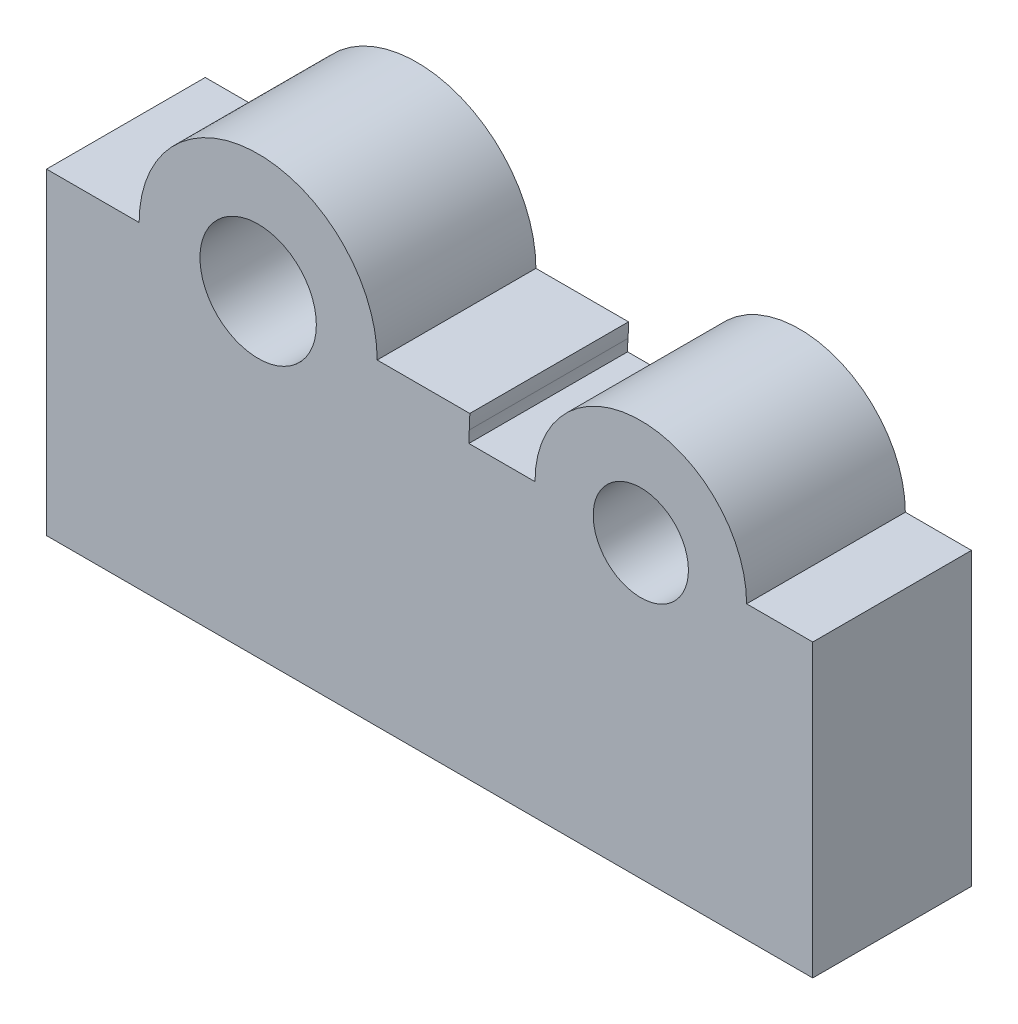
ISO-10303-21;
HEADER;
FILE_DESCRIPTION(('STEP AP214'),'2;1');
FILE_NAME('part.step','',(''),(''),'','','');
FILE_SCHEMA(('AUTOMOTIVE_DESIGN { 1 0 10303 214 1 1 1 1 }'));
ENDSEC;
DATA;
#1=APPLICATION_CONTEXT('core data for automotive mechanical design processes');
#2=APPLICATION_PROTOCOL_DEFINITION('international standard','automotive_design',2000,#1);
#3=PRODUCT_CONTEXT('',#1,'mechanical');
#4=PRODUCT('Part','Part','',(#3));
#5=PRODUCT_RELATED_PRODUCT_CATEGORY('part','',(#4));
#6=PRODUCT_DEFINITION_FORMATION('','',#4);
#7=PRODUCT_DEFINITION_CONTEXT('part definition',#1,'design');
#8=PRODUCT_DEFINITION('design','',#6,#7);
#9=PRODUCT_DEFINITION_SHAPE('','',#8);
#10=(LENGTH_UNIT() NAMED_UNIT(*) SI_UNIT(.MILLI.,.METRE.));
#11=(NAMED_UNIT(*) PLANE_ANGLE_UNIT() SI_UNIT($,.RADIAN.));
#12=(NAMED_UNIT(*) SI_UNIT($,.STERADIAN.) SOLID_ANGLE_UNIT());
#13=UNCERTAINTY_MEASURE_WITH_UNIT(LENGTH_MEASURE(1.E-05),#10,'distance_accuracy_value','');
#14=(GEOMETRIC_REPRESENTATION_CONTEXT(3) GLOBAL_UNCERTAINTY_ASSIGNED_CONTEXT((#13)) GLOBAL_UNIT_ASSIGNED_CONTEXT((#10,
#11,#12)) REPRESENTATION_CONTEXT('',''));
#15=CARTESIAN_POINT('',(0.,0.,0.));
#16=DIRECTION('',(0.,0.,1.));
#17=DIRECTION('',(1.,0.,0.));
#18=AXIS2_PLACEMENT_3D('',#15,#16,#17);
#19=CARTESIAN_POINT('',(0.,0.,30.));
#20=DIRECTION('',(0.,0.,-1.));
#21=DIRECTION('',(-1.,0.,0.));
#22=AXIS2_PLACEMENT_3D('',#19,#20,#21);
#23=CYLINDRICAL_SURFACE('',#22,11.2);
#24=CARTESIAN_POINT('',(0.,0.,0.));
#25=DIRECTION('',(0.,0.,1.));
#26=DIRECTION('',(1.,0.,0.));
#27=AXIS2_PLACEMENT_3D('',#24,#25,#26);
#28=CIRCLE('',#27,11.2);
#29=CARTESIAN_POINT('',(11.2,0.,0.));
#30=VERTEX_POINT('',#29);
#31=EDGE_CURVE('E178',#30,#30,#28,.T.);
#32=ORIENTED_EDGE('',*,*,#31,.F.);
#33=EDGE_LOOP('',(#32));
#34=FACE_BOUND('',#33,.T.);
#35=CARTESIAN_POINT('',(0.,0.,7.));
#36=DIRECTION('',(0.,0.,1.));
#37=DIRECTION('',(1.,0.,0.));
#38=AXIS2_PLACEMENT_3D('',#35,#36,#37);
#39=CIRCLE('',#38,11.2);
#40=CARTESIAN_POINT('',(11.2,0.,7.));
#41=VERTEX_POINT('',#40);
#42=EDGE_CURVE('E211',#41,#41,#39,.T.);
#43=ORIENTED_EDGE('',*,*,#42,.T.);
#44=EDGE_LOOP('',(#43));
#45=FACE_BOUND('',#44,.T.);
#46=ADVANCED_FACE('F51',(#34,#45),#23,.F.);
#47=CARTESIAN_POINT('',(0.,0.,30.));
#48=DIRECTION('',(0.,0.,-1.));
#49=DIRECTION('',(-1.,0.,0.));
#50=AXIS2_PLACEMENT_3D('',#47,#48,#49);
#51=CYLINDRICAL_SURFACE('',#50,32.5);
#52=CARTESIAN_POINT('',(0.,0.,0.));
#53=DIRECTION('',(0.,0.,1.));
#54=DIRECTION('',(1.,0.,0.));
#55=AXIS2_PLACEMENT_3D('',#52,#53,#54);
#56=CIRCLE('',#55,32.5);
#57=CARTESIAN_POINT('',(-32.4226189378211,2.24137931034483,0.));
#58=VERTEX_POINT('',#57);
#59=CARTESIAN_POINT('',(-32.5,0.,0.));
#60=VERTEX_POINT('',#59);
#61=EDGE_CURVE('E165',#58,#60,#56,.T.);
#62=ORIENTED_EDGE('',*,*,#61,.F.);
#63=DIRECTION('',(0.,0.,-1.));
#64=VECTOR('',#63,1.);
#65=CARTESIAN_POINT('',(-32.4226189378211,2.24137931034483,30.));
#66=LINE('',#65,#64);
#67=CARTESIAN_POINT('',(-32.4226189378211,2.24137931034483,30.));
#68=VERTEX_POINT('',#67);
#69=EDGE_CURVE('E12',#68,#58,#66,.T.);
#70=ORIENTED_EDGE('',*,*,#69,.F.);
#71=CARTESIAN_POINT('',(0.,0.,30.));
#72=DIRECTION('',(0.,0.,1.));
#73=DIRECTION('',(1.,0.,0.));
#74=AXIS2_PLACEMENT_3D('',#71,#72,#73);
#75=CIRCLE('',#74,32.5);
#76=CARTESIAN_POINT('',(-32.5,0.,30.));
#77=VERTEX_POINT('',#76);
#78=EDGE_CURVE('E225',#68,#77,#75,.T.);
#79=ORIENTED_EDGE('',*,*,#78,.T.);
#80=DIRECTION('',(0.,0.,-1.));
#81=VECTOR('',#80,1.);
#82=CARTESIAN_POINT('',(-32.5,0.,30.));
#83=LINE('',#82,#81);
#84=EDGE_CURVE('E182',#77,#60,#83,.T.);
#85=ORIENTED_EDGE('',*,*,#84,.T.);
#86=EDGE_LOOP('',(#62,#70,#79,#85));
#87=FACE_BOUND('',#86,.T.);
#88=ADVANCED_FACE('F53',(#87),#51,.F.);
#89=CARTESIAN_POINT('',(-72.3273807074472,5.,30.));
#90=DIRECTION('',(0.,0.,-1.));
#91=DIRECTION('',(-1.,0.,0.));
#92=AXIS2_PLACEMENT_3D('',#89,#90,#91);
#93=CYLINDRICAL_SURFACE('',#92,40.);
#94=CARTESIAN_POINT('',(-72.3273807074472,5.,0.));
#95=DIRECTION('',(0.,0.,1.));
#96=DIRECTION('',(1.,0.,0.));
#97=AXIS2_PLACEMENT_3D('',#94,#95,#96);
#98=CIRCLE('',#97,40.);
#99=CARTESIAN_POINT('',(-32.3273807074472,5.00000000000001,0.));
#100=VERTEX_POINT('',#99);
#101=EDGE_CURVE('E162',#58,#100,#98,.T.);
#102=ORIENTED_EDGE('',*,*,#101,.T.);
#103=DIRECTION('',(0.,0.,-1.));
#104=VECTOR('',#103,1.);
#105=CARTESIAN_POINT('',(-32.3273807074472,5.00000000000001,30.));
#106=LINE('',#105,#104);
#107=CARTESIAN_POINT('',(-32.3273807074472,5.00000000000001,30.));
#108=VERTEX_POINT('',#107);
#109=EDGE_CURVE('E60',#108,#100,#106,.T.);
#110=ORIENTED_EDGE('',*,*,#109,.F.);
#111=CARTESIAN_POINT('',(-72.3273807074472,5.,30.));
#112=DIRECTION('',(0.,0.,1.));
#113=DIRECTION('',(1.,0.,0.));
#114=AXIS2_PLACEMENT_3D('',#111,#112,#113);
#115=CIRCLE('',#114,40.);
#116=EDGE_CURVE('E228',#68,#108,#115,.T.);
#117=ORIENTED_EDGE('',*,*,#116,.F.);
#118=ORIENTED_EDGE('',*,*,#69,.T.);
#119=EDGE_LOOP('',(#102,#110,#117,#118));
#120=FACE_BOUND('',#119,.T.);
#121=ADVANCED_FACE('F307',(#120),#93,.T.);
#122=CARTESIAN_POINT('',(0.,5.00000000000002,30.));
#123=DIRECTION('',(0.,1.,0.));
#124=DIRECTION('',(-1.,0.,0.));
#125=AXIS2_PLACEMENT_3D('',#122,#123,#124);
#126=PLANE('',#125);
#127=DIRECTION('',(0.,0.,1.));
#128=VECTOR('',#127,1.);
#129=CARTESIAN_POINT('',(-49.8273807074472,5.00000000000001,-63.6396103067893));
#130=LINE('',#129,#128);
#131=CARTESIAN_POINT('',(-49.8273807074472,5.00000000000001,30.));
#132=VERTEX_POINT('',#131);
#133=CARTESIAN_POINT('',(-49.8273807074472,5.00000000000001,0.));
#134=VERTEX_POINT('',#133);
#135=EDGE_CURVE('E135',#132,#134,#130,.F.);
#136=ORIENTED_EDGE('',*,*,#135,.F.);
#137=DIRECTION('',(1.,0.,0.));
#138=VECTOR('',#137,1.);
#139=CARTESIAN_POINT('',(0.,5.00000000000002,30.));
#140=LINE('',#139,#138);
#141=EDGE_CURVE('E231',#132,#108,#140,.T.);
#142=ORIENTED_EDGE('',*,*,#141,.T.);
#143=ORIENTED_EDGE('',*,*,#109,.T.);
#144=DIRECTION('',(1.,0.,0.));
#145=VECTOR('',#144,1.);
#146=CARTESIAN_POINT('',(0.,5.00000000000002,0.));
#147=LINE('',#146,#145);
#148=EDGE_CURVE('E153',#134,#100,#147,.T.);
#149=ORIENTED_EDGE('',*,*,#148,.F.);
#150=EDGE_LOOP('',(#136,#142,#143,#149));
#151=FACE_BOUND('',#150,.T.);
#152=ADVANCED_FACE('F159',(#151),#126,.T.);
#153=DIRECTION('',(0.,0.,1.));
#154=VECTOR('',#153,1.);
#155=CARTESIAN_POINT('',(-94.8273807074472,5.,-63.6396103067893));
#156=LINE('',#155,#154);
#157=CARTESIAN_POINT('',(-94.8273807074472,5.,0.));
#158=VERTEX_POINT('',#157);
#159=CARTESIAN_POINT('',(-94.8273807074472,5.,30.));
#160=VERTEX_POINT('',#159);
#161=EDGE_CURVE('E146',#158,#160,#156,.T.);
#162=ORIENTED_EDGE('',*,*,#161,.F.);
#163=CARTESIAN_POINT('',(-112.327380707447,4.99999999999999,0.));
#164=VERTEX_POINT('',#163);
#165=EDGE_CURVE('E157',#164,#158,#147,.T.);
#166=ORIENTED_EDGE('',*,*,#165,.F.);
#167=DIRECTION('',(0.,0.,-1.));
#168=VECTOR('',#167,1.);
#169=CARTESIAN_POINT('',(-112.327380707447,4.99999999999999,30.));
#170=LINE('',#169,#168);
#171=CARTESIAN_POINT('',(-112.327380707447,4.99999999999999,30.));
#172=VERTEX_POINT('',#171);
#173=EDGE_CURVE('E192',#172,#164,#170,.T.);
#174=ORIENTED_EDGE('',*,*,#173,.F.);
#175=EDGE_CURVE('E204',#172,#160,#140,.T.);
#176=ORIENTED_EDGE('',*,*,#175,.T.);
#177=EDGE_LOOP('',(#162,#166,#174,#176));
#178=FACE_BOUND('',#177,.T.);
#179=ADVANCED_FACE('F203',(#178),#126,.T.);
#180=CARTESIAN_POINT('',(-112.327380707447,0.,30.));
#181=DIRECTION('',(1.,0.,0.));
#182=DIRECTION('',(0.,1.,0.));
#183=AXIS2_PLACEMENT_3D('',#180,#181,#182);
#184=PLANE('',#183);
#185=DIRECTION('',(0.,-1.,0.));
#186=VECTOR('',#185,1.);
#187=CARTESIAN_POINT('',(-112.327380707447,0.,0.));
#188=LINE('',#187,#186);
#189=CARTESIAN_POINT('',(-112.327380707447,-55.,0.));
#190=VERTEX_POINT('',#189);
#191=EDGE_CURVE('E164',#164,#190,#188,.T.);
#192=ORIENTED_EDGE('',*,*,#191,.T.);
#193=DIRECTION('',(0.,0.,-1.));
#194=VECTOR('',#193,1.);
#195=CARTESIAN_POINT('',(-112.327380707447,-55.,30.));
#196=LINE('',#195,#194);
#197=CARTESIAN_POINT('',(-112.327380707447,-55.,30.));
#198=VERTEX_POINT('',#197);
#199=EDGE_CURVE('E189',#198,#190,#196,.T.);
#200=ORIENTED_EDGE('',*,*,#199,.F.);
#201=DIRECTION('',(0.,-1.,0.));
#202=VECTOR('',#201,1.);
#203=CARTESIAN_POINT('',(-112.327380707447,0.,30.));
#204=LINE('',#203,#202);
#205=EDGE_CURVE('E198',#172,#198,#204,.T.);
#206=ORIENTED_EDGE('',*,*,#205,.F.);
#207=ORIENTED_EDGE('',*,*,#173,.T.);
#208=EDGE_LOOP('',(#192,#200,#206,#207));
#209=FACE_BOUND('',#208,.T.);
#210=ADVANCED_FACE('F196',(#209),#184,.F.);
#211=CARTESIAN_POINT('',(0.,-55.,30.));
#212=DIRECTION('',(0.,1.,0.));
#213=DIRECTION('',(-1.,0.,0.));
#214=AXIS2_PLACEMENT_3D('',#211,#212,#213);
#215=PLANE('',#214);
#216=DIRECTION('',(1.,0.,0.));
#217=VECTOR('',#216,1.);
#218=CARTESIAN_POINT('',(0.,-55.,0.));
#219=LINE('',#218,#217);
#220=CARTESIAN_POINT('',(32.5,-55.,0.));
#221=VERTEX_POINT('',#220);
#222=EDGE_CURVE('E170',#190,#221,#219,.T.);
#223=ORIENTED_EDGE('',*,*,#222,.T.);
#224=DIRECTION('',(0.,0.,-1.));
#225=VECTOR('',#224,1.);
#226=CARTESIAN_POINT('',(32.5,-55.,30.));
#227=LINE('',#226,#225);
#228=CARTESIAN_POINT('',(32.5,-55.,30.));
#229=VERTEX_POINT('',#228);
#230=EDGE_CURVE('E187',#229,#221,#227,.T.);
#231=ORIENTED_EDGE('',*,*,#230,.F.);
#232=DIRECTION('',(1.,0.,0.));
#233=VECTOR('',#232,1.);
#234=CARTESIAN_POINT('',(0.,-55.,30.));
#235=LINE('',#234,#233);
#236=EDGE_CURVE('E234',#198,#229,#235,.T.);
#237=ORIENTED_EDGE('',*,*,#236,.F.);
#238=ORIENTED_EDGE('',*,*,#199,.T.);
#239=EDGE_LOOP('',(#223,#231,#237,#238));
#240=FACE_BOUND('',#239,.T.);
#241=ADVANCED_FACE('F258',(#240),#215,.F.);
#242=CARTESIAN_POINT('',(32.5,0.,30.));
#243=DIRECTION('',(1.,0.,0.));
#244=DIRECTION('',(0.,1.,0.));
#245=AXIS2_PLACEMENT_3D('',#242,#243,#244);
#246=PLANE('',#245);
#247=DIRECTION('',(0.,-1.,0.));
#248=VECTOR('',#247,1.);
#249=CARTESIAN_POINT('',(32.5,0.,0.));
#250=LINE('',#249,#248);
#251=CARTESIAN_POINT('',(32.5,0.,0.));
#252=VERTEX_POINT('',#251);
#253=EDGE_CURVE('E173',#252,#221,#250,.T.);
#254=ORIENTED_EDGE('',*,*,#253,.F.);
#255=DIRECTION('',(0.,0.,-1.));
#256=VECTOR('',#255,1.);
#257=CARTESIAN_POINT('',(32.5,0.,30.));
#258=LINE('',#257,#256);
#259=CARTESIAN_POINT('',(32.5,0.,30.));
#260=VERTEX_POINT('',#259);
#261=EDGE_CURVE('E185',#260,#252,#258,.T.);
#262=ORIENTED_EDGE('',*,*,#261,.F.);
#263=DIRECTION('',(0.,-1.,0.));
#264=VECTOR('',#263,1.);
#265=CARTESIAN_POINT('',(32.5,0.,30.));
#266=LINE('',#265,#264);
#267=EDGE_CURVE('E236',#260,#229,#266,.T.);
#268=ORIENTED_EDGE('',*,*,#267,.T.);
#269=ORIENTED_EDGE('',*,*,#230,.T.);
#270=EDGE_LOOP('',(#254,#262,#268,#269));
#271=FACE_BOUND('',#270,.T.);
#272=ADVANCED_FACE('F253',(#271),#246,.T.);
#273=CARTESIAN_POINT('',(0.,0.,30.));
#274=DIRECTION('',(0.,-1.,0.));
#275=DIRECTION('',(1.,0.,0.));
#276=AXIS2_PLACEMENT_3D('',#273,#274,#275);
#277=PLANE('',#276);
#278=DIRECTION('',(-1.,0.,0.));
#279=VECTOR('',#278,1.);
#280=CARTESIAN_POINT('',(0.,0.,0.));
#281=LINE('',#280,#279);
#282=CARTESIAN_POINT('',(20.,0.,0.));
#283=VERTEX_POINT('',#282);
#284=EDGE_CURVE('E176',#252,#283,#281,.T.);
#285=ORIENTED_EDGE('',*,*,#284,.T.);
#286=DIRECTION('',(0.,0.,1.));
#287=VECTOR('',#286,1.);
#288=CARTESIAN_POINT('',(20.,0.,-56.5685424949238));
#289=LINE('',#288,#287);
#290=CARTESIAN_POINT('',(20.,0.,30.));
#291=VERTEX_POINT('',#290);
#292=EDGE_CURVE('E75',#283,#291,#289,.T.);
#293=ORIENTED_EDGE('',*,*,#292,.T.);
#294=DIRECTION('',(-1.,0.,0.));
#295=VECTOR('',#294,1.);
#296=CARTESIAN_POINT('',(0.,0.,30.));
#297=LINE('',#296,#295);
#298=EDGE_CURVE('E239',#260,#291,#297,.T.);
#299=ORIENTED_EDGE('',*,*,#298,.F.);
#300=ORIENTED_EDGE('',*,*,#261,.T.);
#301=EDGE_LOOP('',(#285,#293,#299,#300));
#302=FACE_BOUND('',#301,.T.);
#303=ADVANCED_FACE('F313',(#302),#277,.F.);
#304=CARTESIAN_POINT('',(-20.,0.,30.));
#305=VERTEX_POINT('',#304);
#306=EDGE_CURVE('E67',#305,#77,#297,.T.);
#307=ORIENTED_EDGE('',*,*,#306,.F.);
#308=DIRECTION('',(0.,0.,1.));
#309=VECTOR('',#308,1.);
#310=CARTESIAN_POINT('',(-20.,0.,-56.5685424949238));
#311=LINE('',#310,#309);
#312=CARTESIAN_POINT('',(-20.,0.,0.));
#313=VERTEX_POINT('',#312);
#314=EDGE_CURVE('E220',#305,#313,#311,.F.);
#315=ORIENTED_EDGE('',*,*,#314,.T.);
#316=EDGE_CURVE('E179',#313,#60,#281,.T.);
#317=ORIENTED_EDGE('',*,*,#316,.T.);
#318=ORIENTED_EDGE('',*,*,#84,.F.);
#319=EDGE_LOOP('',(#307,#315,#317,#318));
#320=FACE_BOUND('',#319,.T.);
#321=ADVANCED_FACE('F245',(#320),#277,.F.);
#322=CARTESIAN_POINT('',(0.,0.,30.));
#323=DIRECTION('',(0.,0.,1.));
#324=DIRECTION('',(1.,0.,0.));
#325=AXIS2_PLACEMENT_3D('',#322,#323,#324);
#326=PLANE('',#325);
#327=CARTESIAN_POINT('',(-72.3273807074472,5.,30.));
#328=DIRECTION('',(0.,0.,1.));
#329=DIRECTION('',(1.,0.,0.));
#330=AXIS2_PLACEMENT_3D('',#327,#328,#329);
#331=CIRCLE('',#330,11.);
#332=CARTESIAN_POINT('',(-61.3273807074472,5.,30.));
#333=VERTEX_POINT('',#332);
#334=EDGE_CURVE('E269',#333,#333,#331,.T.);
#335=ORIENTED_EDGE('',*,*,#334,.F.);
#336=EDGE_LOOP('',(#335));
#337=FACE_BOUND('',#336,.T.);
#338=ORIENTED_EDGE('',*,*,#141,.F.);
#339=CARTESIAN_POINT('',(-72.3273807074472,5.,30.));
#340=DIRECTION('',(0.,0.,1.));
#341=DIRECTION('',(1.,0.,0.));
#342=AXIS2_PLACEMENT_3D('',#339,#340,#341);
#343=CIRCLE('',#342,22.5);
#344=EDGE_CURVE('E141',#132,#160,#343,.T.);
#345=ORIENTED_EDGE('',*,*,#344,.T.);
#346=ORIENTED_EDGE('',*,*,#175,.F.);
#347=ORIENTED_EDGE('',*,*,#205,.T.);
#348=ORIENTED_EDGE('',*,*,#236,.T.);
#349=ORIENTED_EDGE('',*,*,#267,.F.);
#350=ORIENTED_EDGE('',*,*,#298,.T.);
#351=CARTESIAN_POINT('',(0.,0.,30.));
#352=DIRECTION('',(0.,0.,1.));
#353=DIRECTION('',(1.,0.,0.));
#354=AXIS2_PLACEMENT_3D('',#351,#352,#353);
#355=CIRCLE('',#354,20.);
#356=EDGE_CURVE('E216',#291,#305,#355,.T.);
#357=ORIENTED_EDGE('',*,*,#356,.T.);
#358=ORIENTED_EDGE('',*,*,#306,.T.);
#359=ORIENTED_EDGE('',*,*,#78,.F.);
#360=ORIENTED_EDGE('',*,*,#116,.T.);
#361=EDGE_LOOP('',(#338,#345,#346,#347,#348,#349,#350,#357,#358,#359,#360));
#362=FACE_BOUND('',#361,.T.);
#363=CARTESIAN_POINT('',(0.,0.,30.));
#364=DIRECTION('',(0.,0.,1.));
#365=DIRECTION('',(1.,0.,0.));
#366=AXIS2_PLACEMENT_3D('',#363,#364,#365);
#367=CIRCLE('',#366,9.);
#368=CARTESIAN_POINT('',(9.,0.,30.));
#369=VERTEX_POINT('',#368);
#370=EDGE_CURVE('E145',#369,#369,#367,.T.);
#371=ORIENTED_EDGE('',*,*,#370,.F.);
#372=EDGE_LOOP('',(#371));
#373=FACE_BOUND('',#372,.T.);
#374=ADVANCED_FACE('F260',(#337,#362,#373),#326,.T.);
#375=CARTESIAN_POINT('',(0.,0.,0.));
#376=DIRECTION('',(0.,0.,1.));
#377=DIRECTION('',(1.,0.,0.));
#378=AXIS2_PLACEMENT_3D('',#375,#376,#377);
#379=PLANE('',#378);
#380=CARTESIAN_POINT('',(-72.3273807074472,5.,0.));
#381=DIRECTION('',(0.,0.,1.));
#382=DIRECTION('',(1.,0.,0.));
#383=AXIS2_PLACEMENT_3D('',#380,#381,#382);
#384=CIRCLE('',#383,13.2);
#385=CARTESIAN_POINT('',(-59.1273807074472,5.,0.));
#386=VERTEX_POINT('',#385);
#387=EDGE_CURVE('E264',#386,#386,#384,.T.);
#388=ORIENTED_EDGE('',*,*,#387,.T.);
#389=EDGE_LOOP('',(#388));
#390=FACE_BOUND('',#389,.T.);
#391=CARTESIAN_POINT('',(-72.3273807074472,5.,0.));
#392=DIRECTION('',(0.,0.,1.));
#393=DIRECTION('',(1.,0.,0.));
#394=AXIS2_PLACEMENT_3D('',#391,#392,#393);
#395=CIRCLE('',#394,22.5);
#396=EDGE_CURVE('E138',#158,#134,#395,.F.);
#397=ORIENTED_EDGE('',*,*,#396,.T.);
#398=ORIENTED_EDGE('',*,*,#148,.T.);
#399=ORIENTED_EDGE('',*,*,#101,.F.);
#400=ORIENTED_EDGE('',*,*,#61,.T.);
#401=ORIENTED_EDGE('',*,*,#316,.F.);
#402=CARTESIAN_POINT('',(0.,0.,0.));
#403=DIRECTION('',(0.,0.,1.));
#404=DIRECTION('',(1.,0.,0.));
#405=AXIS2_PLACEMENT_3D('',#402,#403,#404);
#406=CIRCLE('',#405,20.);
#407=EDGE_CURVE('E217',#313,#283,#406,.F.);
#408=ORIENTED_EDGE('',*,*,#407,.T.);
#409=ORIENTED_EDGE('',*,*,#284,.F.);
#410=ORIENTED_EDGE('',*,*,#253,.T.);
#411=ORIENTED_EDGE('',*,*,#222,.F.);
#412=ORIENTED_EDGE('',*,*,#191,.F.);
#413=ORIENTED_EDGE('',*,*,#165,.T.);
#414=EDGE_LOOP('',(#397,#398,#399,#400,#401,#408,#409,#410,#411,#412,#413));
#415=FACE_BOUND('',#414,.T.);
#416=ORIENTED_EDGE('',*,*,#31,.T.);
#417=EDGE_LOOP('',(#416));
#418=FACE_BOUND('',#417,.T.);
#419=ADVANCED_FACE('F150',(#390,#415,#418),#379,.F.);
#420=CARTESIAN_POINT('',(0.,0.,-56.5685424949238));
#421=DIRECTION('',(0.,0.,1.));
#422=DIRECTION('',(1.,0.,0.));
#423=AXIS2_PLACEMENT_3D('',#420,#421,#422);
#424=CYLINDRICAL_SURFACE('',#423,20.);
#425=ORIENTED_EDGE('',*,*,#292,.F.);
#426=ORIENTED_EDGE('',*,*,#407,.F.);
#427=ORIENTED_EDGE('',*,*,#314,.F.);
#428=ORIENTED_EDGE('',*,*,#356,.F.);
#429=EDGE_LOOP('',(#425,#426,#427,#428));
#430=FACE_BOUND('',#429,.T.);
#431=ADVANCED_FACE('F249',(#430),#424,.T.);
#432=CARTESIAN_POINT('',(0.,0.,7.));
#433=DIRECTION('',(0.,0.,1.));
#434=DIRECTION('',(1.,0.,0.));
#435=AXIS2_PLACEMENT_3D('',#432,#433,#434);
#436=PLANE('',#435);
#437=CARTESIAN_POINT('',(0.,0.,7.));
#438=DIRECTION('',(0.,0.,1.));
#439=DIRECTION('',(1.,0.,0.));
#440=AXIS2_PLACEMENT_3D('',#437,#438,#439);
#441=CIRCLE('',#440,9.);
#442=CARTESIAN_POINT('',(9.,0.,7.));
#443=VERTEX_POINT('',#442);
#444=EDGE_CURVE('E208',#443,#443,#441,.T.);
#445=ORIENTED_EDGE('',*,*,#444,.T.);
#446=EDGE_LOOP('',(#445));
#447=FACE_BOUND('',#446,.T.);
#448=ORIENTED_EDGE('',*,*,#42,.F.);
#449=EDGE_LOOP('',(#448));
#450=FACE_BOUND('',#449,.T.);
#451=ADVANCED_FACE('F296',(#447,#450),#436,.F.);
#452=CARTESIAN_POINT('',(0.,0.,7.));
#453=DIRECTION('',(0.,0.,1.));
#454=DIRECTION('',(1.,0.,0.));
#455=AXIS2_PLACEMENT_3D('',#452,#453,#454);
#456=CYLINDRICAL_SURFACE('',#455,9.);
#457=ORIENTED_EDGE('',*,*,#444,.F.);
#458=EDGE_LOOP('',(#457));
#459=FACE_BOUND('',#458,.T.);
#460=ORIENTED_EDGE('',*,*,#370,.T.);
#461=EDGE_LOOP('',(#460));
#462=FACE_BOUND('',#461,.T.);
#463=ADVANCED_FACE('F372',(#459,#462),#456,.F.);
#464=CARTESIAN_POINT('',(-72.3273807074472,5.,-63.6396103067893));
#465=DIRECTION('',(0.,0.,1.));
#466=DIRECTION('',(1.,0.,0.));
#467=AXIS2_PLACEMENT_3D('',#464,#465,#466);
#468=CYLINDRICAL_SURFACE('',#467,22.5);
#469=ORIENTED_EDGE('',*,*,#344,.F.);
#470=ORIENTED_EDGE('',*,*,#135,.T.);
#471=ORIENTED_EDGE('',*,*,#396,.F.);
#472=ORIENTED_EDGE('',*,*,#161,.T.);
#473=EDGE_LOOP('',(#469,#470,#471,#472));
#474=FACE_BOUND('',#473,.T.);
#475=ADVANCED_FACE('F137',(#474),#468,.T.);
#476=CARTESIAN_POINT('',(-72.3273807074472,5.,10.2));
#477=DIRECTION('',(0.,0.,-1.));
#478=DIRECTION('',(-1.,0.,0.));
#479=AXIS2_PLACEMENT_3D('',#476,#477,#478);
#480=CYLINDRICAL_SURFACE('',#479,13.2);
#481=CARTESIAN_POINT('',(-72.3273807074472,5.,10.2));
#482=DIRECTION('',(0.,0.,1.));
#483=DIRECTION('',(1.,0.,0.));
#484=AXIS2_PLACEMENT_3D('',#481,#482,#483);
#485=CIRCLE('',#484,13.2);
#486=CARTESIAN_POINT('',(-59.1273807074472,5.,10.2));
#487=VERTEX_POINT('',#486);
#488=EDGE_CURVE('E262',#487,#487,#485,.T.);
#489=ORIENTED_EDGE('',*,*,#488,.T.);
#490=EDGE_LOOP('',(#489));
#491=FACE_BOUND('',#490,.T.);
#492=ORIENTED_EDGE('',*,*,#387,.F.);
#493=EDGE_LOOP('',(#492));
#494=FACE_BOUND('',#493,.T.);
#495=ADVANCED_FACE('F281',(#491,#494),#480,.F.);
#496=CARTESIAN_POINT('',(-72.3273807074472,5.,10.2));
#497=DIRECTION('',(0.,0.,1.));
#498=DIRECTION('',(1.,0.,0.));
#499=AXIS2_PLACEMENT_3D('',#496,#497,#498);
#500=PLANE('',#499);
#501=CARTESIAN_POINT('',(-72.3273807074472,5.,10.2));
#502=DIRECTION('',(0.,0.,1.));
#503=DIRECTION('',(1.,0.,0.));
#504=AXIS2_PLACEMENT_3D('',#501,#502,#503);
#505=CIRCLE('',#504,11.);
#506=CARTESIAN_POINT('',(-61.3273807074472,5.,10.2));
#507=VERTEX_POINT('',#506);
#508=EDGE_CURVE('E55',#507,#507,#505,.F.);
#509=ORIENTED_EDGE('',*,*,#508,.F.);
#510=EDGE_LOOP('',(#509));
#511=FACE_BOUND('',#510,.T.);
#512=ORIENTED_EDGE('',*,*,#488,.F.);
#513=EDGE_LOOP('',(#512));
#514=FACE_BOUND('',#513,.T.);
#515=ADVANCED_FACE('F278',(#511,#514),#500,.F.);
#516=CARTESIAN_POINT('',(-72.3273807074472,5.,30.));
#517=DIRECTION('',(0.,0.,-1.));
#518=DIRECTION('',(-1.,0.,0.));
#519=AXIS2_PLACEMENT_3D('',#516,#517,#518);
#520=CYLINDRICAL_SURFACE('',#519,11.);
#521=ORIENTED_EDGE('',*,*,#334,.T.);
#522=EDGE_LOOP('',(#521));
#523=FACE_BOUND('',#522,.T.);
#524=ORIENTED_EDGE('',*,*,#508,.T.);
#525=EDGE_LOOP('',(#524));
#526=FACE_BOUND('',#525,.T.);
#527=ADVANCED_FACE('F276',(#523,#526),#520,.F.);
#528=CLOSED_SHELL('',(#46,#88,#121,#152,#179,#210,#241,#272,#303,#321,#374,#419,#431,#451,#463,
#475,#495,#515,#527));
#529=MANIFOLD_SOLID_BREP('B2',#528);
#530=ADVANCED_BREP_SHAPE_REPRESENTATION('',(#18,#529),#14);
#531=SHAPE_DEFINITION_REPRESENTATION(#9,#530);
ENDSEC;
END-ISO-10303-21;
